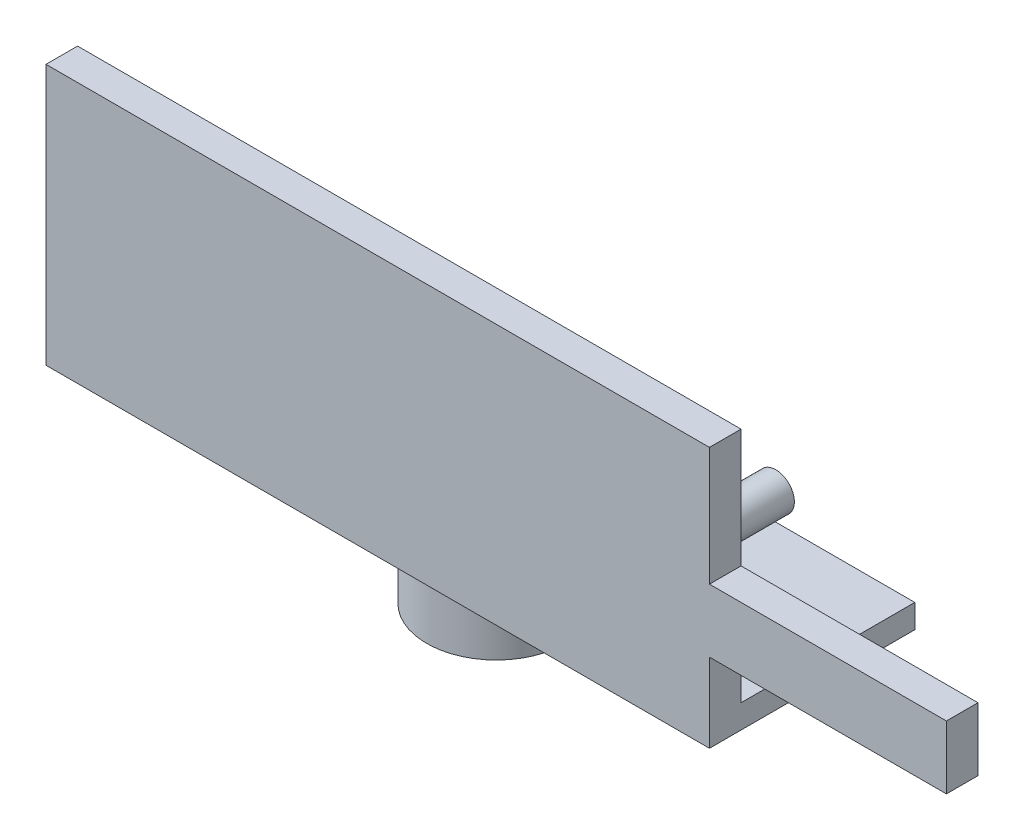
ISO-10303-21;
HEADER;
FILE_DESCRIPTION(('STEP AP214'),'2;1');
FILE_NAME('part.step','',(''),(''),'','','');
FILE_SCHEMA(('AUTOMOTIVE_DESIGN { 1 0 10303 214 1 1 1 1 }'));
ENDSEC;
DATA;
#1=APPLICATION_CONTEXT('core data for automotive mechanical design processes');
#2=APPLICATION_PROTOCOL_DEFINITION('international standard','automotive_design',2000,#1);
#3=PRODUCT_CONTEXT('',#1,'mechanical');
#4=PRODUCT('Part','Part','',(#3));
#5=PRODUCT_RELATED_PRODUCT_CATEGORY('part','',(#4));
#6=PRODUCT_DEFINITION_FORMATION('','',#4);
#7=PRODUCT_DEFINITION_CONTEXT('part definition',#1,'design');
#8=PRODUCT_DEFINITION('design','',#6,#7);
#9=PRODUCT_DEFINITION_SHAPE('','',#8);
#10=(LENGTH_UNIT() NAMED_UNIT(*) SI_UNIT(.MILLI.,.METRE.));
#11=(NAMED_UNIT(*) PLANE_ANGLE_UNIT() SI_UNIT($,.RADIAN.));
#12=(NAMED_UNIT(*) SI_UNIT($,.STERADIAN.) SOLID_ANGLE_UNIT());
#13=UNCERTAINTY_MEASURE_WITH_UNIT(LENGTH_MEASURE(1.E-05),#10,'distance_accuracy_value','');
#14=(GEOMETRIC_REPRESENTATION_CONTEXT(3) GLOBAL_UNCERTAINTY_ASSIGNED_CONTEXT((#13)) GLOBAL_UNIT_ASSIGNED_CONTEXT((#10,
#11,#12)) REPRESENTATION_CONTEXT('',''));
#15=CARTESIAN_POINT('',(0.,0.,0.));
#16=DIRECTION('',(0.,0.,1.));
#17=DIRECTION('',(1.,0.,0.));
#18=AXIS2_PLACEMENT_3D('',#15,#16,#17);
#19=CARTESIAN_POINT('',(0.,0.,0.));
#20=DIRECTION('',(0.,0.,-1.));
#21=DIRECTION('',(-1.,0.,0.));
#22=AXIS2_PLACEMENT_3D('',#19,#20,#21);
#23=PLANE('',#22);
#24=CARTESIAN_POINT('',(3.,7.50000000000001,0.));
#25=DIRECTION('',(0.,0.,-1.));
#26=DIRECTION('',(1.,0.,0.));
#27=AXIS2_PLACEMENT_3D('',#24,#25,#26);
#28=CIRCLE('',#27,1.175);
#29=CARTESIAN_POINT('',(4.175,7.50000000000001,0.));
#30=VERTEX_POINT('',#29);
#31=EDGE_CURVE('E229',#30,#30,#28,.T.);
#32=ORIENTED_EDGE('',*,*,#31,.F.);
#33=EDGE_LOOP('',(#32));
#34=FACE_BOUND('',#33,.T.);
#35=CARTESIAN_POINT('',(39.,7.5,0.));
#36=DIRECTION('',(0.,0.,-1.));
#37=DIRECTION('',(-1.,0.,0.));
#38=AXIS2_PLACEMENT_3D('',#35,#36,#37);
#39=CIRCLE('',#38,1.175);
#40=CARTESIAN_POINT('',(37.825,7.5,0.));
#41=VERTEX_POINT('',#40);
#42=EDGE_CURVE('E233',#41,#41,#39,.T.);
#43=ORIENTED_EDGE('',*,*,#42,.F.);
#44=EDGE_LOOP('',(#43));
#45=FACE_BOUND('',#44,.T.);
#46=DIRECTION('',(0.,1.,0.));
#47=VECTOR('',#46,1.);
#48=CARTESIAN_POINT('',(42.,0.,0.));
#49=LINE('',#48,#47);
#50=CARTESIAN_POINT('',(42.,0.,0.));
#51=VERTEX_POINT('',#50);
#52=CARTESIAN_POINT('',(42.,3.5,0.));
#53=VERTEX_POINT('',#52);
#54=EDGE_CURVE('E254',#51,#53,#49,.T.);
#55=ORIENTED_EDGE('',*,*,#54,.F.);
#56=DIRECTION('',(1.,0.,0.));
#57=VECTOR('',#56,1.);
#58=CARTESIAN_POINT('',(42.,0.,0.));
#59=LINE('',#58,#57);
#60=CARTESIAN_POINT('',(0.,0.,0.));
#61=VERTEX_POINT('',#60);
#62=EDGE_CURVE('E177',#61,#51,#59,.T.);
#63=ORIENTED_EDGE('',*,*,#62,.F.);
#64=DIRECTION('',(0.,-1.,0.));
#65=VECTOR('',#64,1.);
#66=CARTESIAN_POINT('',(0.,0.,0.));
#67=LINE('',#66,#65);
#68=CARTESIAN_POINT('',(0.,15.,0.));
#69=VERTEX_POINT('',#68);
#70=EDGE_CURVE('E239',#69,#61,#67,.T.);
#71=ORIENTED_EDGE('',*,*,#70,.F.);
#72=DIRECTION('',(-1.,0.,0.));
#73=VECTOR('',#72,1.);
#74=CARTESIAN_POINT('',(0.,15.,0.));
#75=LINE('',#74,#73);
#76=CARTESIAN_POINT('',(42.,15.,0.));
#77=VERTEX_POINT('',#76);
#78=EDGE_CURVE('E244',#77,#69,#75,.T.);
#79=ORIENTED_EDGE('',*,*,#78,.F.);
#80=CARTESIAN_POINT('',(42.,7.5,0.));
#81=VERTEX_POINT('',#80);
#82=EDGE_CURVE('E253',#81,#77,#49,.T.);
#83=ORIENTED_EDGE('',*,*,#82,.F.);
#84=DIRECTION('',(-1.,0.,0.));
#85=VECTOR('',#84,1.);
#86=CARTESIAN_POINT('',(57.,7.50000000000001,0.));
#87=LINE('',#86,#85);
#88=CARTESIAN_POINT('',(57.,7.50000000000001,0.));
#89=VERTEX_POINT('',#88);
#90=EDGE_CURVE('E220',#89,#81,#87,.T.);
#91=ORIENTED_EDGE('',*,*,#90,.F.);
#92=DIRECTION('',(0.,1.,0.));
#93=VECTOR('',#92,1.);
#94=CARTESIAN_POINT('',(57.,3.50000000000001,0.));
#95=LINE('',#94,#93);
#96=CARTESIAN_POINT('',(57.,3.50000000000001,0.));
#97=VERTEX_POINT('',#96);
#98=EDGE_CURVE('E210',#97,#89,#95,.T.);
#99=ORIENTED_EDGE('',*,*,#98,.F.);
#100=DIRECTION('',(-1.,0.,0.));
#101=VECTOR('',#100,1.);
#102=CARTESIAN_POINT('',(57.,3.50000000000001,0.));
#103=LINE('',#102,#101);
#104=EDGE_CURVE('E223',#97,#53,#103,.T.);
#105=ORIENTED_EDGE('',*,*,#104,.T.);
#106=EDGE_LOOP('',(#55,#63,#71,#79,#83,#91,#99,#105));
#107=FACE_BOUND('',#106,.T.);
#108=ADVANCED_FACE('F33',(#34,#45,#107),#23,.T.);
#109=CARTESIAN_POINT('',(42.,0.,2.));
#110=DIRECTION('',(-1.,0.,0.));
#111=DIRECTION('',(0.,-1.,0.));
#112=AXIS2_PLACEMENT_3D('',#109,#110,#111);
#113=PLANE('',#112);
#114=DIRECTION('',(0.,0.,1.));
#115=VECTOR('',#114,1.);
#116=CARTESIAN_POINT('',(42.,7.5,2.));
#117=LINE('',#116,#115);
#118=CARTESIAN_POINT('',(42.,7.5,2.));
#119=VERTEX_POINT('',#118);
#120=EDGE_CURVE('E208',#81,#119,#117,.T.);
#121=ORIENTED_EDGE('',*,*,#120,.F.);
#122=ORIENTED_EDGE('',*,*,#82,.T.);
#123=DIRECTION('',(0.,0.,-1.));
#124=VECTOR('',#123,1.);
#125=CARTESIAN_POINT('',(42.,15.,2.));
#126=LINE('',#125,#124);
#127=CARTESIAN_POINT('',(42.,15.,2.));
#128=VERTEX_POINT('',#127);
#129=EDGE_CURVE('E37',#128,#77,#126,.T.);
#130=ORIENTED_EDGE('',*,*,#129,.F.);
#131=DIRECTION('',(0.,1.,0.));
#132=VECTOR('',#131,1.);
#133=CARTESIAN_POINT('',(42.,0.,2.));
#134=LINE('',#133,#132);
#135=EDGE_CURVE('E57',#119,#128,#134,.T.);
#136=ORIENTED_EDGE('',*,*,#135,.F.);
#137=EDGE_LOOP('',(#121,#122,#130,#136));
#138=FACE_BOUND('',#137,.T.);
#139=ADVANCED_FACE('F293',(#138),#113,.F.);
#140=DIRECTION('',(0.,0.,-1.));
#141=VECTOR('',#140,1.);
#142=CARTESIAN_POINT('',(42.,3.5,2.));
#143=LINE('',#142,#141);
#144=CARTESIAN_POINT('',(42.,3.5,2.));
#145=VERTEX_POINT('',#144);
#146=EDGE_CURVE('E203',#145,#53,#143,.T.);
#147=ORIENTED_EDGE('',*,*,#146,.F.);
#148=CARTESIAN_POINT('',(42.,-1.5,2.));
#149=VERTEX_POINT('',#148);
#150=EDGE_CURVE('E245',#149,#145,#134,.T.);
#151=ORIENTED_EDGE('',*,*,#150,.F.);
#152=DIRECTION('',(0.,0.,1.));
#153=VECTOR('',#152,1.);
#154=CARTESIAN_POINT('',(42.,-1.5,0.));
#155=LINE('',#154,#153);
#156=CARTESIAN_POINT('',(42.,-1.5,-11.));
#157=VERTEX_POINT('',#156);
#158=EDGE_CURVE('E197',#157,#149,#155,.T.);
#159=ORIENTED_EDGE('',*,*,#158,.F.);
#160=DIRECTION('',(0.,-1.,0.));
#161=VECTOR('',#160,1.);
#162=CARTESIAN_POINT('',(42.,-1.5,-11.));
#163=LINE('',#162,#161);
#164=CARTESIAN_POINT('',(42.,0.,-11.));
#165=VERTEX_POINT('',#164);
#166=EDGE_CURVE('E179',#165,#157,#163,.T.);
#167=ORIENTED_EDGE('',*,*,#166,.F.);
#168=DIRECTION('',(0.,0.,1.));
#169=VECTOR('',#168,1.);
#170=CARTESIAN_POINT('',(42.,0.,-11.));
#171=LINE('',#170,#169);
#172=EDGE_CURVE('E189',#165,#51,#171,.T.);
#173=ORIENTED_EDGE('',*,*,#172,.T.);
#174=ORIENTED_EDGE('',*,*,#54,.T.);
#175=EDGE_LOOP('',(#147,#151,#159,#167,#173,#174));
#176=FACE_BOUND('',#175,.T.);
#177=ADVANCED_FACE('F295',(#176),#113,.F.);
#178=CARTESIAN_POINT('',(0.,0.,2.));
#179=DIRECTION('',(1.,0.,0.));
#180=DIRECTION('',(0.,0.,-1.));
#181=AXIS2_PLACEMENT_3D('',#178,#179,#180);
#182=PLANE('',#181);
#183=ORIENTED_EDGE('',*,*,#70,.T.);
#184=DIRECTION('',(0.,0.,1.));
#185=VECTOR('',#184,1.);
#186=CARTESIAN_POINT('',(0.,0.,-11.));
#187=LINE('',#186,#185);
#188=CARTESIAN_POINT('',(0.,0.,-11.));
#189=VERTEX_POINT('',#188);
#190=EDGE_CURVE('E193',#189,#61,#187,.T.);
#191=ORIENTED_EDGE('',*,*,#190,.F.);
#192=DIRECTION('',(0.,1.,0.));
#193=VECTOR('',#192,1.);
#194=CARTESIAN_POINT('',(0.,-1.5,-11.));
#195=LINE('',#194,#193);
#196=CARTESIAN_POINT('',(0.,-1.5,-11.));
#197=VERTEX_POINT('',#196);
#198=EDGE_CURVE('E185',#197,#189,#195,.T.);
#199=ORIENTED_EDGE('',*,*,#198,.F.);
#200=DIRECTION('',(0.,0.,-1.));
#201=VECTOR('',#200,1.);
#202=CARTESIAN_POINT('',(0.,-1.5,2.));
#203=LINE('',#202,#201);
#204=CARTESIAN_POINT('',(0.,-1.5,2.));
#205=VERTEX_POINT('',#204);
#206=EDGE_CURVE('E195',#205,#197,#203,.T.);
#207=ORIENTED_EDGE('',*,*,#206,.F.);
#208=DIRECTION('',(0.,-1.,0.));
#209=VECTOR('',#208,1.);
#210=CARTESIAN_POINT('',(0.,0.,2.));
#211=LINE('',#210,#209);
#212=CARTESIAN_POINT('',(0.,15.,2.));
#213=VERTEX_POINT('',#212);
#214=EDGE_CURVE('E242',#213,#205,#211,.T.);
#215=ORIENTED_EDGE('',*,*,#214,.F.);
#216=DIRECTION('',(0.,0.,-1.));
#217=VECTOR('',#216,1.);
#218=CARTESIAN_POINT('',(0.,15.,2.));
#219=LINE('',#218,#217);
#220=EDGE_CURVE('E250',#213,#69,#219,.T.);
#221=ORIENTED_EDGE('',*,*,#220,.T.);
#222=EDGE_LOOP('',(#183,#191,#199,#207,#215,#221));
#223=FACE_BOUND('',#222,.T.);
#224=ADVANCED_FACE('F35',(#223),#182,.F.);
#225=CARTESIAN_POINT('',(0.,15.,2.));
#226=DIRECTION('',(0.,-1.,0.));
#227=DIRECTION('',(0.,0.,-1.));
#228=AXIS2_PLACEMENT_3D('',#225,#226,#227);
#229=PLANE('',#228);
#230=ORIENTED_EDGE('',*,*,#78,.T.);
#231=ORIENTED_EDGE('',*,*,#220,.F.);
#232=DIRECTION('',(-1.,0.,0.));
#233=VECTOR('',#232,1.);
#234=CARTESIAN_POINT('',(0.,15.,2.));
#235=LINE('',#234,#233);
#236=EDGE_CURVE('E248',#128,#213,#235,.T.);
#237=ORIENTED_EDGE('',*,*,#236,.F.);
#238=ORIENTED_EDGE('',*,*,#129,.T.);
#239=EDGE_LOOP('',(#230,#231,#237,#238));
#240=FACE_BOUND('',#239,.T.);
#241=ADVANCED_FACE('F265',(#240),#229,.F.);
#242=CARTESIAN_POINT('',(0.,0.,2.));
#243=DIRECTION('',(0.,0.,-1.));
#244=DIRECTION('',(-1.,0.,0.));
#245=AXIS2_PLACEMENT_3D('',#242,#243,#244);
#246=PLANE('',#245);
#247=ORIENTED_EDGE('',*,*,#214,.T.);
#248=DIRECTION('',(-1.,0.,0.));
#249=VECTOR('',#248,1.);
#250=CARTESIAN_POINT('',(42.,-1.5,2.));
#251=LINE('',#250,#249);
#252=EDGE_CURVE('E200',#149,#205,#251,.T.);
#253=ORIENTED_EDGE('',*,*,#252,.F.);
#254=ORIENTED_EDGE('',*,*,#150,.T.);
#255=DIRECTION('',(-1.,0.,0.));
#256=VECTOR('',#255,1.);
#257=CARTESIAN_POINT('',(57.,3.50000000000001,2.));
#258=LINE('',#257,#256);
#259=CARTESIAN_POINT('',(57.,3.50000000000001,2.));
#260=VERTEX_POINT('',#259);
#261=EDGE_CURVE('E226',#260,#145,#258,.T.);
#262=ORIENTED_EDGE('',*,*,#261,.F.);
#263=DIRECTION('',(0.,-1.,0.));
#264=VECTOR('',#263,1.);
#265=CARTESIAN_POINT('',(57.,3.50000000000001,2.));
#266=LINE('',#265,#264);
#267=CARTESIAN_POINT('',(57.,7.50000000000001,2.));
#268=VERTEX_POINT('',#267);
#269=EDGE_CURVE('E204',#268,#260,#266,.T.);
#270=ORIENTED_EDGE('',*,*,#269,.F.);
#271=DIRECTION('',(-1.,0.,0.));
#272=VECTOR('',#271,1.);
#273=CARTESIAN_POINT('',(57.,7.50000000000001,2.));
#274=LINE('',#273,#272);
#275=EDGE_CURVE('E214',#268,#119,#274,.T.);
#276=ORIENTED_EDGE('',*,*,#275,.T.);
#277=ORIENTED_EDGE('',*,*,#135,.T.);
#278=ORIENTED_EDGE('',*,*,#236,.T.);
#279=EDGE_LOOP('',(#247,#253,#254,#262,#270,#276,#277,#278));
#280=FACE_BOUND('',#279,.T.);
#281=ADVANCED_FACE('F286',(#280),#246,.F.);
#282=CARTESIAN_POINT('',(39.,7.5,-5.2));
#283=DIRECTION('',(0.,0.,1.));
#284=DIRECTION('',(1.,0.,0.));
#285=AXIS2_PLACEMENT_3D('',#282,#283,#284);
#286=CYLINDRICAL_SURFACE('',#285,1.175);
#287=CARTESIAN_POINT('',(39.,7.5,-5.2));
#288=DIRECTION('',(0.,0.,-1.));
#289=DIRECTION('',(-1.,0.,0.));
#290=AXIS2_PLACEMENT_3D('',#287,#288,#289);
#291=CIRCLE('',#290,1.175);
#292=CARTESIAN_POINT('',(37.825,7.5,-5.2));
#293=VERTEX_POINT('',#292);
#294=EDGE_CURVE('E236',#293,#293,#291,.T.);
#295=ORIENTED_EDGE('',*,*,#294,.F.);
#296=EDGE_LOOP('',(#295));
#297=FACE_BOUND('',#296,.T.);
#298=ORIENTED_EDGE('',*,*,#42,.T.);
#299=EDGE_LOOP('',(#298));
#300=FACE_BOUND('',#299,.T.);
#301=ADVANCED_FACE('F308',(#297,#300),#286,.T.);
#302=CARTESIAN_POINT('',(39.,7.5,-5.2));
#303=DIRECTION('',(0.,0.,-1.));
#304=DIRECTION('',(-1.,0.,0.));
#305=AXIS2_PLACEMENT_3D('',#302,#303,#304);
#306=PLANE('',#305);
#307=ORIENTED_EDGE('',*,*,#294,.T.);
#308=EDGE_LOOP('',(#307));
#309=FACE_BOUND('',#308,.T.);
#310=ADVANCED_FACE('F311',(#309),#306,.T.);
#311=CARTESIAN_POINT('',(3.,7.50000000000001,-5.2));
#312=DIRECTION('',(0.,0.,1.));
#313=DIRECTION('',(1.,0.,0.));
#314=AXIS2_PLACEMENT_3D('',#311,#312,#313);
#315=CYLINDRICAL_SURFACE('',#314,1.175);
#316=CARTESIAN_POINT('',(3.,7.50000000000001,-5.2));
#317=DIRECTION('',(0.,0.,-1.));
#318=DIRECTION('',(1.,0.,0.));
#319=AXIS2_PLACEMENT_3D('',#316,#317,#318);
#320=CIRCLE('',#319,1.175);
#321=CARTESIAN_POINT('',(4.175,7.50000000000001,-5.2));
#322=VERTEX_POINT('',#321);
#323=EDGE_CURVE('E230',#322,#322,#320,.T.);
#324=ORIENTED_EDGE('',*,*,#323,.F.);
#325=EDGE_LOOP('',(#324));
#326=FACE_BOUND('',#325,.T.);
#327=ORIENTED_EDGE('',*,*,#31,.T.);
#328=EDGE_LOOP('',(#327));
#329=FACE_BOUND('',#328,.T.);
#330=ADVANCED_FACE('F315',(#326,#329),#315,.T.);
#331=CARTESIAN_POINT('',(3.,7.50000000000001,-5.2));
#332=DIRECTION('',(0.,0.,1.));
#333=DIRECTION('',(1.,0.,0.));
#334=AXIS2_PLACEMENT_3D('',#331,#332,#333);
#335=PLANE('',#334);
#336=ORIENTED_EDGE('',*,*,#323,.T.);
#337=EDGE_LOOP('',(#336));
#338=FACE_BOUND('',#337,.T.);
#339=ADVANCED_FACE('F319',(#338),#335,.F.);
#340=CARTESIAN_POINT('',(57.,3.50000000000001,2.));
#341=DIRECTION('',(0.,1.,0.));
#342=DIRECTION('',(-1.,0.,0.));
#343=AXIS2_PLACEMENT_3D('',#340,#341,#342);
#344=PLANE('',#343);
#345=ORIENTED_EDGE('',*,*,#146,.T.);
#346=ORIENTED_EDGE('',*,*,#104,.F.);
#347=DIRECTION('',(0.,0.,-1.));
#348=VECTOR('',#347,1.);
#349=CARTESIAN_POINT('',(57.,3.50000000000001,2.));
#350=LINE('',#349,#348);
#351=EDGE_CURVE('E207',#260,#97,#350,.T.);
#352=ORIENTED_EDGE('',*,*,#351,.F.);
#353=ORIENTED_EDGE('',*,*,#261,.T.);
#354=EDGE_LOOP('',(#345,#346,#352,#353));
#355=FACE_BOUND('',#354,.T.);
#356=ADVANCED_FACE('F323',(#355),#344,.F.);
#357=CARTESIAN_POINT('',(57.,7.50000000000001,2.));
#358=DIRECTION('',(0.,-1.,0.));
#359=DIRECTION('',(1.,0.,0.));
#360=AXIS2_PLACEMENT_3D('',#357,#358,#359);
#361=PLANE('',#360);
#362=ORIENTED_EDGE('',*,*,#120,.T.);
#363=ORIENTED_EDGE('',*,*,#275,.F.);
#364=DIRECTION('',(0.,0.,1.));
#365=VECTOR('',#364,1.);
#366=CARTESIAN_POINT('',(57.,7.50000000000001,2.));
#367=LINE('',#366,#365);
#368=EDGE_CURVE('E212',#89,#268,#367,.T.);
#369=ORIENTED_EDGE('',*,*,#368,.F.);
#370=ORIENTED_EDGE('',*,*,#90,.T.);
#371=EDGE_LOOP('',(#362,#363,#369,#370));
#372=FACE_BOUND('',#371,.T.);
#373=ADVANCED_FACE('F292',(#372),#361,.F.);
#374=CARTESIAN_POINT('',(57.,0.,0.));
#375=DIRECTION('',(-1.,0.,0.));
#376=DIRECTION('',(0.,0.,1.));
#377=AXIS2_PLACEMENT_3D('',#374,#375,#376);
#378=PLANE('',#377);
#379=ORIENTED_EDGE('',*,*,#269,.T.);
#380=ORIENTED_EDGE('',*,*,#351,.T.);
#381=ORIENTED_EDGE('',*,*,#98,.T.);
#382=ORIENTED_EDGE('',*,*,#368,.T.);
#383=EDGE_LOOP('',(#379,#380,#381,#382));
#384=FACE_BOUND('',#383,.T.);
#385=ADVANCED_FACE('F330',(#384),#378,.F.);
#386=CARTESIAN_POINT('',(0.,-1.5,0.));
#387=DIRECTION('',(0.,-1.,0.));
#388=DIRECTION('',(0.,0.,-1.));
#389=AXIS2_PLACEMENT_3D('',#386,#387,#388);
#390=PLANE('',#389);
#391=CARTESIAN_POINT('',(21.,-1.5,-5.5));
#392=DIRECTION('',(0.,-1.,0.));
#393=DIRECTION('',(0.,0.,-1.));
#394=AXIS2_PLACEMENT_3D('',#391,#392,#393);
#395=CIRCLE('',#394,4.4023797666796);
#396=CARTESIAN_POINT('',(21.,-1.5,-9.9023797666796));
#397=VERTEX_POINT('',#396);
#398=EDGE_CURVE('E11',#397,#397,#395,.T.);
#399=ORIENTED_EDGE('',*,*,#398,.F.);
#400=EDGE_LOOP('',(#399));
#401=FACE_BOUND('',#400,.T.);
#402=ORIENTED_EDGE('',*,*,#206,.T.);
#403=DIRECTION('',(-1.,0.,0.));
#404=VECTOR('',#403,1.);
#405=CARTESIAN_POINT('',(42.,-1.5,-11.));
#406=LINE('',#405,#404);
#407=EDGE_CURVE('E182',#157,#197,#406,.T.);
#408=ORIENTED_EDGE('',*,*,#407,.F.);
#409=ORIENTED_EDGE('',*,*,#158,.T.);
#410=ORIENTED_EDGE('',*,*,#252,.T.);
#411=EDGE_LOOP('',(#402,#408,#409,#410));
#412=FACE_BOUND('',#411,.T.);
#413=ADVANCED_FACE('F283',(#401,#412),#390,.T.);
#414=CARTESIAN_POINT('',(42.,0.,-11.));
#415=DIRECTION('',(0.,-1.,0.));
#416=DIRECTION('',(0.,0.,-1.));
#417=AXIS2_PLACEMENT_3D('',#414,#415,#416);
#418=PLANE('',#417);
#419=ORIENTED_EDGE('',*,*,#62,.T.);
#420=ORIENTED_EDGE('',*,*,#172,.F.);
#421=DIRECTION('',(1.,0.,0.));
#422=VECTOR('',#421,1.);
#423=CARTESIAN_POINT('',(42.,0.,-11.));
#424=LINE('',#423,#422);
#425=EDGE_CURVE('E187',#189,#165,#424,.T.);
#426=ORIENTED_EDGE('',*,*,#425,.F.);
#427=ORIENTED_EDGE('',*,*,#190,.T.);
#428=EDGE_LOOP('',(#419,#420,#426,#427));
#429=FACE_BOUND('',#428,.T.);
#430=ADVANCED_FACE('F277',(#429),#418,.F.);
#431=CARTESIAN_POINT('',(0.,0.,-11.));
#432=DIRECTION('',(0.,0.,1.));
#433=DIRECTION('',(1.,0.,0.));
#434=AXIS2_PLACEMENT_3D('',#431,#432,#433);
#435=PLANE('',#434);
#436=ORIENTED_EDGE('',*,*,#166,.T.);
#437=ORIENTED_EDGE('',*,*,#407,.T.);
#438=ORIENTED_EDGE('',*,*,#198,.T.);
#439=ORIENTED_EDGE('',*,*,#425,.T.);
#440=EDGE_LOOP('',(#436,#437,#438,#439));
#441=FACE_BOUND('',#440,.T.);
#442=ADVANCED_FACE('F280',(#441),#435,.F.);
#443=CARTESIAN_POINT('',(21.,-7.8,-5.5));
#444=DIRECTION('',(0.,-1.,0.));
#445=DIRECTION('',(0.,0.,-1.));
#446=AXIS2_PLACEMENT_3D('',#443,#444,#445);
#447=PLANE('',#446);
#448=CARTESIAN_POINT('',(21.,-7.8,-5.5));
#449=DIRECTION('',(0.,-1.,0.));
#450=DIRECTION('',(0.,0.,-1.));
#451=AXIS2_PLACEMENT_3D('',#448,#449,#450);
#452=CIRCLE('',#451,4.4023797666796);
#453=CARTESIAN_POINT('',(21.,-7.8,-9.9023797666796));
#454=VERTEX_POINT('',#453);
#455=EDGE_CURVE('E152',#454,#454,#452,.T.);
#456=ORIENTED_EDGE('',*,*,#455,.T.);
#457=EDGE_LOOP('',(#456));
#458=FACE_BOUND('',#457,.T.);
#459=DIRECTION('',(1.,0.,0.));
#460=VECTOR('',#459,1.);
#461=CARTESIAN_POINT('',(19.0020590640111,-7.8,-7.00274150015889));
#462=LINE('',#461,#460);
#463=CARTESIAN_POINT('',(19.0020590640111,-7.8,-7.00274150015889));
#464=VERTEX_POINT('',#463);
#465=CARTESIAN_POINT('',(22.9979409359889,-7.8,-7.00274150015889));
#466=VERTEX_POINT('',#465);
#467=EDGE_CURVE('E144',#464,#466,#462,.T.);
#468=ORIENTED_EDGE('',*,*,#467,.F.);
#469=CARTESIAN_POINT('',(21.,-7.8,-5.5));
#470=DIRECTION('',(0.,-1.,0.));
#471=DIRECTION('',(0.,0.,-1.));
#472=AXIS2_PLACEMENT_3D('',#469,#470,#471);
#473=CIRCLE('',#472,2.5);
#474=CARTESIAN_POINT('',(18.9979468077362,-7.8,-4.00274150015889));
#475=VERTEX_POINT('',#474);
#476=EDGE_CURVE('E136',#475,#464,#473,.T.);
#477=ORIENTED_EDGE('',*,*,#476,.F.);
#478=DIRECTION('',(-1.,0.,0.));
#479=VECTOR('',#478,1.);
#480=CARTESIAN_POINT('',(18.9979468077362,-7.8,-4.00274150015889));
#481=LINE('',#480,#479);
#482=CARTESIAN_POINT('',(23.0020531922638,-7.8,-4.00274150015889));
#483=VERTEX_POINT('',#482);
#484=EDGE_CURVE('E160',#483,#475,#481,.T.);
#485=ORIENTED_EDGE('',*,*,#484,.F.);
#486=CARTESIAN_POINT('',(21.,-7.8,-5.5));
#487=DIRECTION('',(0.,-1.,0.));
#488=DIRECTION('',(0.,0.,-1.));
#489=AXIS2_PLACEMENT_3D('',#486,#487,#488);
#490=CIRCLE('',#489,2.5);
#491=EDGE_CURVE('E158',#466,#483,#490,.T.);
#492=ORIENTED_EDGE('',*,*,#491,.F.);
#493=EDGE_LOOP('',(#468,#477,#485,#492));
#494=FACE_BOUND('',#493,.T.);
#495=ADVANCED_FACE('F156',(#458,#494),#447,.T.);
#496=CARTESIAN_POINT('',(21.,-7.8,-5.5));
#497=DIRECTION('',(0.,1.,0.));
#498=DIRECTION('',(0.,0.,1.));
#499=AXIS2_PLACEMENT_3D('',#496,#497,#498);
#500=CYLINDRICAL_SURFACE('',#499,4.4023797666796);
#501=ORIENTED_EDGE('',*,*,#455,.F.);
#502=EDGE_LOOP('',(#501));
#503=FACE_BOUND('',#502,.T.);
#504=ORIENTED_EDGE('',*,*,#398,.T.);
#505=EDGE_LOOP('',(#504));
#506=FACE_BOUND('',#505,.T.);
#507=ADVANCED_FACE('F342',(#503,#506),#500,.T.);
#508=CARTESIAN_POINT('',(21.,-7.8,-5.5));
#509=DIRECTION('',(0.,1.,0.));
#510=DIRECTION('',(0.,0.,1.));
#511=AXIS2_PLACEMENT_3D('',#508,#509,#510);
#512=CYLINDRICAL_SURFACE('',#511,2.5);
#513=CARTESIAN_POINT('',(21.,-1.5,-5.5));
#514=DIRECTION('',(0.,-1.,0.));
#515=DIRECTION('',(0.,0.,-1.));
#516=AXIS2_PLACEMENT_3D('',#513,#514,#515);
#517=CIRCLE('',#516,2.5);
#518=CARTESIAN_POINT('',(18.9979468077362,-1.5,-4.00274150015889));
#519=VERTEX_POINT('',#518);
#520=CARTESIAN_POINT('',(19.0020590640111,-1.5,-7.00274150015889));
#521=VERTEX_POINT('',#520);
#522=EDGE_CURVE('E164',#519,#521,#517,.T.);
#523=ORIENTED_EDGE('',*,*,#522,.F.);
#524=DIRECTION('',(0.,1.,0.));
#525=VECTOR('',#524,1.);
#526=CARTESIAN_POINT('',(18.9979468077362,-7.8,-4.00274150015889));
#527=LINE('',#526,#525);
#528=EDGE_CURVE('E49',#475,#519,#527,.T.);
#529=ORIENTED_EDGE('',*,*,#528,.F.);
#530=ORIENTED_EDGE('',*,*,#476,.T.);
#531=DIRECTION('',(0.,1.,0.));
#532=VECTOR('',#531,1.);
#533=CARTESIAN_POINT('',(19.0020590640111,-7.8,-7.00274150015889));
#534=LINE('',#533,#532);
#535=EDGE_CURVE('E139',#464,#521,#534,.T.);
#536=ORIENTED_EDGE('',*,*,#535,.T.);
#537=EDGE_LOOP('',(#523,#529,#530,#536));
#538=FACE_BOUND('',#537,.T.);
#539=ADVANCED_FACE('F138',(#538),#512,.F.);
#540=CARTESIAN_POINT('',(19.0020590640111,-7.8,-7.00274150015889));
#541=DIRECTION('',(0.,0.,1.));
#542=DIRECTION('',(1.,0.,0.));
#543=AXIS2_PLACEMENT_3D('',#540,#541,#542);
#544=PLANE('',#543);
#545=DIRECTION('',(1.,0.,0.));
#546=VECTOR('',#545,1.);
#547=CARTESIAN_POINT('',(19.0020590640111,-1.5,-7.00274150015889));
#548=LINE('',#547,#546);
#549=CARTESIAN_POINT('',(22.9979409359889,-1.5,-7.00274150015889));
#550=VERTEX_POINT('',#549);
#551=EDGE_CURVE('E151',#521,#550,#548,.T.);
#552=ORIENTED_EDGE('',*,*,#551,.F.);
#553=ORIENTED_EDGE('',*,*,#535,.F.);
#554=ORIENTED_EDGE('',*,*,#467,.T.);
#555=DIRECTION('',(0.,1.,0.));
#556=VECTOR('',#555,1.);
#557=CARTESIAN_POINT('',(22.9979409359889,-7.8,-7.00274150015889));
#558=LINE('',#557,#556);
#559=EDGE_CURVE('E153',#466,#550,#558,.T.);
#560=ORIENTED_EDGE('',*,*,#559,.T.);
#561=EDGE_LOOP('',(#552,#553,#554,#560));
#562=FACE_BOUND('',#561,.T.);
#563=ADVANCED_FACE('F148',(#562),#544,.T.);
#564=CARTESIAN_POINT('',(21.,-7.8,-5.5));
#565=DIRECTION('',(0.,1.,0.));
#566=DIRECTION('',(0.,0.,1.));
#567=AXIS2_PLACEMENT_3D('',#564,#565,#566);
#568=CYLINDRICAL_SURFACE('',#567,2.5);
#569=CARTESIAN_POINT('',(21.,-1.5,-5.5));
#570=DIRECTION('',(0.,-1.,0.));
#571=DIRECTION('',(0.,0.,-1.));
#572=AXIS2_PLACEMENT_3D('',#569,#570,#571);
#573=CIRCLE('',#572,2.5);
#574=CARTESIAN_POINT('',(23.0020531922638,-1.5,-4.00274150015889));
#575=VERTEX_POINT('',#574);
#576=EDGE_CURVE('E167',#550,#575,#573,.T.);
#577=ORIENTED_EDGE('',*,*,#576,.F.);
#578=ORIENTED_EDGE('',*,*,#559,.F.);
#579=ORIENTED_EDGE('',*,*,#491,.T.);
#580=DIRECTION('',(0.,1.,0.));
#581=VECTOR('',#580,1.);
#582=CARTESIAN_POINT('',(23.0020531922638,-7.8,-4.00274150015889));
#583=LINE('',#582,#581);
#584=EDGE_CURVE('E173',#483,#575,#583,.T.);
#585=ORIENTED_EDGE('',*,*,#584,.T.);
#586=EDGE_LOOP('',(#577,#578,#579,#585));
#587=FACE_BOUND('',#586,.T.);
#588=ADVANCED_FACE('F353',(#587),#568,.F.);
#589=CARTESIAN_POINT('',(18.9979468077362,-7.8,-4.00274150015889));
#590=DIRECTION('',(0.,0.,-1.));
#591=DIRECTION('',(-1.,0.,0.));
#592=AXIS2_PLACEMENT_3D('',#589,#590,#591);
#593=PLANE('',#592);
#594=DIRECTION('',(-1.,0.,0.));
#595=VECTOR('',#594,1.);
#596=CARTESIAN_POINT('',(18.9979468077362,-1.5,-4.00274150015889));
#597=LINE('',#596,#595);
#598=EDGE_CURVE('E145',#575,#519,#597,.T.);
#599=ORIENTED_EDGE('',*,*,#598,.F.);
#600=ORIENTED_EDGE('',*,*,#584,.F.);
#601=ORIENTED_EDGE('',*,*,#484,.T.);
#602=ORIENTED_EDGE('',*,*,#528,.T.);
#603=EDGE_LOOP('',(#599,#600,#601,#602));
#604=FACE_BOUND('',#603,.T.);
#605=ADVANCED_FACE('F356',(#604),#593,.T.);
#606=ORIENTED_EDGE('',*,*,#598,.T.);
#607=ORIENTED_EDGE('',*,*,#522,.T.);
#608=ORIENTED_EDGE('',*,*,#551,.T.);
#609=ORIENTED_EDGE('',*,*,#576,.T.);
#610=EDGE_LOOP('',(#606,#607,#608,#609));
#611=FACE_BOUND('',#610,.T.);
#612=ADVANCED_FACE('F337',(#611),#390,.T.);
#613=CLOSED_SHELL('',(#108,#139,#177,#224,#241,#281,#301,#310,#330,#339,#356,#373,#385,#413,
#430,#442,#495,#507,#539,#563,#588,#605,#612));
#614=MANIFOLD_SOLID_BREP('B2',#613);
#615=ADVANCED_BREP_SHAPE_REPRESENTATION('',(#18,#614),#14);
#616=SHAPE_DEFINITION_REPRESENTATION(#9,#615);
ENDSEC;
END-ISO-10303-21;
